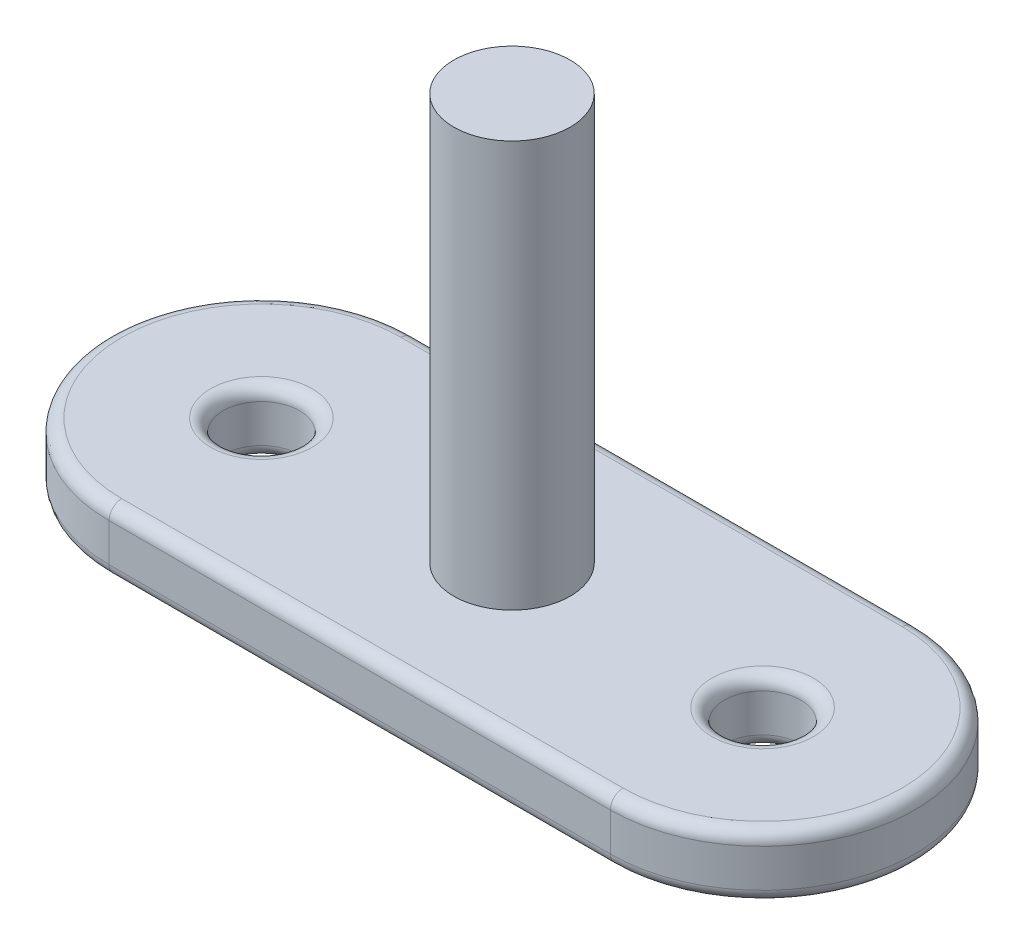
ISO-10303-21;
HEADER;
FILE_DESCRIPTION(('STEP AP214'),'2;1');
FILE_NAME('part.step','',(''),(''),'','','');
FILE_SCHEMA(('AUTOMOTIVE_DESIGN { 1 0 10303 214 1 1 1 1 }'));
ENDSEC;
DATA;
#1=APPLICATION_CONTEXT('core data for automotive mechanical design processes');
#2=APPLICATION_PROTOCOL_DEFINITION('international standard','automotive_design',2000,#1);
#3=PRODUCT_CONTEXT('',#1,'mechanical');
#4=PRODUCT('Part','Part','',(#3));
#5=PRODUCT_RELATED_PRODUCT_CATEGORY('part','',(#4));
#6=PRODUCT_DEFINITION_FORMATION('','',#4);
#7=PRODUCT_DEFINITION_CONTEXT('part definition',#1,'design');
#8=PRODUCT_DEFINITION('design','',#6,#7);
#9=PRODUCT_DEFINITION_SHAPE('','',#8);
#10=(LENGTH_UNIT() NAMED_UNIT(*) SI_UNIT(.MILLI.,.METRE.));
#11=(NAMED_UNIT(*) PLANE_ANGLE_UNIT() SI_UNIT($,.RADIAN.));
#12=(NAMED_UNIT(*) SI_UNIT($,.STERADIAN.) SOLID_ANGLE_UNIT());
#13=UNCERTAINTY_MEASURE_WITH_UNIT(LENGTH_MEASURE(1.E-05),#10,'distance_accuracy_value','');
#14=(GEOMETRIC_REPRESENTATION_CONTEXT(3) GLOBAL_UNCERTAINTY_ASSIGNED_CONTEXT((#13)) GLOBAL_UNIT_ASSIGNED_CONTEXT((#10,
#11,#12)) REPRESENTATION_CONTEXT('',''));
#15=CARTESIAN_POINT('',(0.,0.,0.));
#16=DIRECTION('',(0.,0.,1.));
#17=DIRECTION('',(1.,0.,0.));
#18=AXIS2_PLACEMENT_3D('',#15,#16,#17);
#19=CARTESIAN_POINT('',(-9.87,2.5,0.));
#20=DIRECTION('',(0.,1.,0.));
#21=DIRECTION('',(0.,0.,1.));
#22=AXIS2_PLACEMENT_3D('',#19,#20,#21);
#23=PLANE('',#22);
#24=CARTESIAN_POINT('',(0.,2.5,0.));
#25=DIRECTION('',(0.,1.,0.));
#26=DIRECTION('',(0.,0.,1.));
#27=AXIS2_PLACEMENT_3D('',#24,#25,#26);
#28=CIRCLE('',#27,2.29148448019586);
#29=CARTESIAN_POINT('',(0.,2.5,2.29148448019586));
#30=VERTEX_POINT('',#29);
#31=EDGE_CURVE('E394',#30,#30,#28,.T.);
#32=ORIENTED_EDGE('',*,*,#31,.F.);
#33=EDGE_LOOP('',(#32));
#34=FACE_BOUND('',#33,.T.);
#35=CARTESIAN_POINT('',(9.87,2.5,0.));
#36=DIRECTION('',(0.,1.,0.));
#37=DIRECTION('',(0.,0.,1.));
#38=AXIS2_PLACEMENT_3D('',#35,#36,#37);
#39=CIRCLE('',#38,2.);
#40=CARTESIAN_POINT('',(9.87,2.5,2.));
#41=VERTEX_POINT('',#40);
#42=EDGE_CURVE('E136',#41,#41,#39,.F.);
#43=ORIENTED_EDGE('',*,*,#42,.T.);
#44=EDGE_LOOP('',(#43));
#45=FACE_BOUND('',#44,.T.);
#46=CARTESIAN_POINT('',(9.87,2.5,0.));
#47=DIRECTION('',(0.,1.,0.));
#48=DIRECTION('',(0.,0.,1.));
#49=AXIS2_PLACEMENT_3D('',#46,#47,#48);
#50=CIRCLE('',#49,5.5);
#51=CARTESIAN_POINT('',(9.87,2.5,5.5));
#52=VERTEX_POINT('',#51);
#53=CARTESIAN_POINT('',(9.87,2.5,-5.5));
#54=VERTEX_POINT('',#53);
#55=EDGE_CURVE('E133',#52,#54,#50,.T.);
#56=ORIENTED_EDGE('',*,*,#55,.T.);
#57=DIRECTION('',(-1.,0.,0.));
#58=VECTOR('',#57,1.);
#59=CARTESIAN_POINT('',(-9.87,2.5,-5.5));
#60=LINE('',#59,#58);
#61=CARTESIAN_POINT('',(-9.87,2.5,-5.5));
#62=VERTEX_POINT('',#61);
#63=EDGE_CURVE('E112',#54,#62,#60,.T.);
#64=ORIENTED_EDGE('',*,*,#63,.T.);
#65=CARTESIAN_POINT('',(-9.87,2.5,0.));
#66=DIRECTION('',(0.,1.,0.));
#67=DIRECTION('',(0.,0.,1.));
#68=AXIS2_PLACEMENT_3D('',#65,#66,#67);
#69=CIRCLE('',#68,5.5);
#70=CARTESIAN_POINT('',(-9.87,2.5,5.5));
#71=VERTEX_POINT('',#70);
#72=EDGE_CURVE('E121',#62,#71,#69,.T.);
#73=ORIENTED_EDGE('',*,*,#72,.T.);
#74=DIRECTION('',(1.,0.,0.));
#75=VECTOR('',#74,1.);
#76=CARTESIAN_POINT('',(9.87,2.5,5.5));
#77=LINE('',#76,#75);
#78=EDGE_CURVE('E128',#71,#52,#77,.T.);
#79=ORIENTED_EDGE('',*,*,#78,.T.);
#80=EDGE_LOOP('',(#56,#64,#73,#79));
#81=FACE_BOUND('',#80,.T.);
#82=CARTESIAN_POINT('',(-9.87,2.5,0.));
#83=DIRECTION('',(0.,1.,0.));
#84=DIRECTION('',(0.,0.,1.));
#85=AXIS2_PLACEMENT_3D('',#82,#83,#84);
#86=CIRCLE('',#85,2.);
#87=CARTESIAN_POINT('',(-9.87,2.5,2.));
#88=VERTEX_POINT('',#87);
#89=EDGE_CURVE('E129',#88,#88,#86,.F.);
#90=ORIENTED_EDGE('',*,*,#89,.T.);
#91=EDGE_LOOP('',(#90));
#92=FACE_BOUND('',#91,.T.);
#93=ADVANCED_FACE('F39',(#34,#45,#81,#92),#23,.T.);
#94=CARTESIAN_POINT('',(-9.87,0.,0.));
#95=DIRECTION('',(0.,1.,0.));
#96=DIRECTION('',(0.,0.,1.));
#97=AXIS2_PLACEMENT_3D('',#94,#95,#96);
#98=PLANE('',#97);
#99=CARTESIAN_POINT('',(9.87,0.,0.));
#100=DIRECTION('',(0.,1.,0.));
#101=DIRECTION('',(0.,0.,1.));
#102=AXIS2_PLACEMENT_3D('',#99,#100,#101);
#103=CIRCLE('',#102,2.);
#104=CARTESIAN_POINT('',(9.87,0.,2.));
#105=VERTEX_POINT('',#104);
#106=EDGE_CURVE('E11',#105,#105,#103,.T.);
#107=ORIENTED_EDGE('',*,*,#106,.T.);
#108=EDGE_LOOP('',(#107));
#109=FACE_BOUND('',#108,.T.);
#110=CARTESIAN_POINT('',(-9.87,0.,0.));
#111=DIRECTION('',(0.,1.,0.));
#112=DIRECTION('',(0.,0.,1.));
#113=AXIS2_PLACEMENT_3D('',#110,#111,#112);
#114=CIRCLE('',#113,2.);
#115=CARTESIAN_POINT('',(-9.87,0.,2.));
#116=VERTEX_POINT('',#115);
#117=EDGE_CURVE('E49',#116,#116,#114,.T.);
#118=ORIENTED_EDGE('',*,*,#117,.T.);
#119=EDGE_LOOP('',(#118));
#120=FACE_BOUND('',#119,.T.);
#121=CARTESIAN_POINT('',(9.87,0.,0.));
#122=DIRECTION('',(0.,1.,0.));
#123=DIRECTION('',(0.,0.,1.));
#124=AXIS2_PLACEMENT_3D('',#121,#122,#123);
#125=CIRCLE('',#124,5.5);
#126=CARTESIAN_POINT('',(9.87,0.,-5.5));
#127=VERTEX_POINT('',#126);
#128=CARTESIAN_POINT('',(9.87,0.,5.5));
#129=VERTEX_POINT('',#128);
#130=EDGE_CURVE('E57',#127,#129,#125,.F.);
#131=ORIENTED_EDGE('',*,*,#130,.T.);
#132=DIRECTION('',(1.,0.,0.));
#133=VECTOR('',#132,1.);
#134=CARTESIAN_POINT('',(-9.87,0.,5.5));
#135=LINE('',#134,#133);
#136=CARTESIAN_POINT('',(-9.87,0.,5.5));
#137=VERTEX_POINT('',#136);
#138=EDGE_CURVE('E184',#129,#137,#135,.F.);
#139=ORIENTED_EDGE('',*,*,#138,.T.);
#140=CARTESIAN_POINT('',(-9.87,0.,0.));
#141=DIRECTION('',(0.,1.,0.));
#142=DIRECTION('',(0.,0.,1.));
#143=AXIS2_PLACEMENT_3D('',#140,#141,#142);
#144=CIRCLE('',#143,5.5);
#145=CARTESIAN_POINT('',(-9.87,0.,-5.5));
#146=VERTEX_POINT('',#145);
#147=EDGE_CURVE('E177',#137,#146,#144,.F.);
#148=ORIENTED_EDGE('',*,*,#147,.T.);
#149=DIRECTION('',(-1.,0.,0.));
#150=VECTOR('',#149,1.);
#151=CARTESIAN_POINT('',(-9.87,0.,-5.5));
#152=LINE('',#151,#150);
#153=EDGE_CURVE('E62',#146,#127,#152,.F.);
#154=ORIENTED_EDGE('',*,*,#153,.T.);
#155=EDGE_LOOP('',(#131,#139,#148,#154));
#156=FACE_BOUND('',#155,.T.);
#157=ADVANCED_FACE('F225',(#109,#120,#156),#98,.F.);
#158=CARTESIAN_POINT('',(-9.87,2.5,0.));
#159=DIRECTION('',(0.,-1.,0.));
#160=DIRECTION('',(0.,0.,-1.));
#161=AXIS2_PLACEMENT_3D('',#158,#159,#160);
#162=CYLINDRICAL_SURFACE('',#161,6.);
#163=DIRECTION('',(0.,-1.,0.));
#164=VECTOR('',#163,1.);
#165=CARTESIAN_POINT('',(-9.87,2.5,6.));
#166=LINE('',#165,#164);
#167=CARTESIAN_POINT('',(-9.87,2.,6.));
#168=VERTEX_POINT('',#167);
#169=CARTESIAN_POINT('',(-9.87,0.5,6.));
#170=VERTEX_POINT('',#169);
#171=EDGE_CURVE('E411',#168,#170,#166,.T.);
#172=ORIENTED_EDGE('',*,*,#171,.F.);
#173=CARTESIAN_POINT('',(-9.87,2.,0.));
#174=DIRECTION('',(0.,1.,0.));
#175=DIRECTION('',(0.,0.,1.));
#176=AXIS2_PLACEMENT_3D('',#173,#174,#175);
#177=CIRCLE('',#176,6.);
#178=CARTESIAN_POINT('',(-9.87,2.,-6.));
#179=VERTEX_POINT('',#178);
#180=EDGE_CURVE('E166',#168,#179,#177,.F.);
#181=ORIENTED_EDGE('',*,*,#180,.T.);
#182=DIRECTION('',(0.,-1.,0.));
#183=VECTOR('',#182,1.);
#184=CARTESIAN_POINT('',(-9.87,2.5,-6.));
#185=LINE('',#184,#183);
#186=CARTESIAN_POINT('',(-9.87,0.5,-6.));
#187=VERTEX_POINT('',#186);
#188=EDGE_CURVE('E198',#179,#187,#185,.T.);
#189=ORIENTED_EDGE('',*,*,#188,.T.);
#190=CARTESIAN_POINT('',(-9.87,0.5,0.));
#191=DIRECTION('',(0.,1.,0.));
#192=DIRECTION('',(0.,0.,1.));
#193=AXIS2_PLACEMENT_3D('',#190,#191,#192);
#194=CIRCLE('',#193,6.);
#195=EDGE_CURVE('E163',#187,#170,#194,.T.);
#196=ORIENTED_EDGE('',*,*,#195,.T.);
#197=EDGE_LOOP('',(#172,#181,#189,#196));
#198=FACE_BOUND('',#197,.T.);
#199=ADVANCED_FACE('F227',(#198),#162,.T.);
#200=CARTESIAN_POINT('',(-9.87,2.5,6.));
#201=DIRECTION('',(0.,0.,-1.));
#202=DIRECTION('',(-1.,0.,0.));
#203=AXIS2_PLACEMENT_3D('',#200,#201,#202);
#204=PLANE('',#203);
#205=DIRECTION('',(0.,-1.,0.));
#206=VECTOR('',#205,1.);
#207=CARTESIAN_POINT('',(9.87,2.5,6.));
#208=LINE('',#207,#206);
#209=CARTESIAN_POINT('',(9.87,2.,6.));
#210=VERTEX_POINT('',#209);
#211=CARTESIAN_POINT('',(9.87,0.5,6.));
#212=VERTEX_POINT('',#211);
#213=EDGE_CURVE('E407',#210,#212,#208,.T.);
#214=ORIENTED_EDGE('',*,*,#213,.F.);
#215=DIRECTION('',(1.,0.,0.));
#216=VECTOR('',#215,1.);
#217=CARTESIAN_POINT('',(-9.87,2.,6.));
#218=LINE('',#217,#216);
#219=EDGE_CURVE('E160',#210,#168,#218,.F.);
#220=ORIENTED_EDGE('',*,*,#219,.T.);
#221=ORIENTED_EDGE('',*,*,#171,.T.);
#222=DIRECTION('',(1.,0.,0.));
#223=VECTOR('',#222,1.);
#224=CARTESIAN_POINT('',(-9.87,0.5,6.));
#225=LINE('',#224,#223);
#226=EDGE_CURVE('E156',#170,#212,#225,.T.);
#227=ORIENTED_EDGE('',*,*,#226,.T.);
#228=EDGE_LOOP('',(#214,#220,#221,#227));
#229=FACE_BOUND('',#228,.T.);
#230=ADVANCED_FACE('F234',(#229),#204,.F.);
#231=CARTESIAN_POINT('',(9.87,2.5,0.));
#232=DIRECTION('',(0.,-1.,0.));
#233=DIRECTION('',(0.,0.,-1.));
#234=AXIS2_PLACEMENT_3D('',#231,#232,#233);
#235=CYLINDRICAL_SURFACE('',#234,6.);
#236=DIRECTION('',(0.,-1.,0.));
#237=VECTOR('',#236,1.);
#238=CARTESIAN_POINT('',(9.87,2.5,-6.));
#239=LINE('',#238,#237);
#240=CARTESIAN_POINT('',(9.87,2.,-6.));
#241=VERTEX_POINT('',#240);
#242=CARTESIAN_POINT('',(9.87,0.5,-6.));
#243=VERTEX_POINT('',#242);
#244=EDGE_CURVE('E403',#241,#243,#239,.T.);
#245=ORIENTED_EDGE('',*,*,#244,.F.);
#246=CARTESIAN_POINT('',(9.87,2.,0.));
#247=DIRECTION('',(0.,1.,0.));
#248=DIRECTION('',(0.,0.,1.));
#249=AXIS2_PLACEMENT_3D('',#246,#247,#248);
#250=CIRCLE('',#249,6.);
#251=EDGE_CURVE('E153',#241,#210,#250,.F.);
#252=ORIENTED_EDGE('',*,*,#251,.T.);
#253=ORIENTED_EDGE('',*,*,#213,.T.);
#254=CARTESIAN_POINT('',(9.87,0.5,0.));
#255=DIRECTION('',(0.,1.,0.));
#256=DIRECTION('',(0.,0.,1.));
#257=AXIS2_PLACEMENT_3D('',#254,#255,#256);
#258=CIRCLE('',#257,6.);
#259=EDGE_CURVE('E150',#212,#243,#258,.T.);
#260=ORIENTED_EDGE('',*,*,#259,.T.);
#261=EDGE_LOOP('',(#245,#252,#253,#260));
#262=FACE_BOUND('',#261,.T.);
#263=ADVANCED_FACE('F246',(#262),#235,.T.);
#264=CARTESIAN_POINT('',(-9.87,2.5,-6.));
#265=DIRECTION('',(0.,0.,1.));
#266=DIRECTION('',(1.,0.,0.));
#267=AXIS2_PLACEMENT_3D('',#264,#265,#266);
#268=PLANE('',#267);
#269=ORIENTED_EDGE('',*,*,#188,.F.);
#270=DIRECTION('',(-1.,0.,0.));
#271=VECTOR('',#270,1.);
#272=CARTESIAN_POINT('',(9.87,2.,-6.));
#273=LINE('',#272,#271);
#274=EDGE_CURVE('E114',#179,#241,#273,.F.);
#275=ORIENTED_EDGE('',*,*,#274,.T.);
#276=ORIENTED_EDGE('',*,*,#244,.T.);
#277=DIRECTION('',(-1.,0.,0.));
#278=VECTOR('',#277,1.);
#279=CARTESIAN_POINT('',(-9.87,0.5,-6.));
#280=LINE('',#279,#278);
#281=EDGE_CURVE('E141',#243,#187,#280,.T.);
#282=ORIENTED_EDGE('',*,*,#281,.T.);
#283=EDGE_LOOP('',(#269,#275,#276,#282));
#284=FACE_BOUND('',#283,.T.);
#285=ADVANCED_FACE('F242',(#284),#268,.F.);
#286=CARTESIAN_POINT('',(-9.87,2.5,0.));
#287=DIRECTION('',(0.,-1.,0.));
#288=DIRECTION('',(0.,0.,-1.));
#289=AXIS2_PLACEMENT_3D('',#286,#287,#288);
#290=CYLINDRICAL_SURFACE('',#289,1.5);
#291=CARTESIAN_POINT('',(-9.87,2.,0.));
#292=DIRECTION('',(0.,1.,0.));
#293=DIRECTION('',(0.,0.,1.));
#294=AXIS2_PLACEMENT_3D('',#291,#292,#293);
#295=CIRCLE('',#294,1.5);
#296=CARTESIAN_POINT('',(-9.87,2.,1.5));
#297=VERTEX_POINT('',#296);
#298=EDGE_CURVE('E173',#297,#297,#295,.T.);
#299=ORIENTED_EDGE('',*,*,#298,.T.);
#300=EDGE_LOOP('',(#299));
#301=FACE_BOUND('',#300,.T.);
#302=CARTESIAN_POINT('',(-9.87,0.5,0.));
#303=DIRECTION('',(0.,1.,0.));
#304=DIRECTION('',(0.,0.,1.));
#305=AXIS2_PLACEMENT_3D('',#302,#303,#304);
#306=CIRCLE('',#305,1.5);
#307=CARTESIAN_POINT('',(-9.87,0.5,1.5));
#308=VERTEX_POINT('',#307);
#309=EDGE_CURVE('E169',#308,#308,#306,.F.);
#310=ORIENTED_EDGE('',*,*,#309,.T.);
#311=EDGE_LOOP('',(#310));
#312=FACE_BOUND('',#311,.T.);
#313=ADVANCED_FACE('F245',(#301,#312),#290,.F.);
#314=CARTESIAN_POINT('',(9.87,2.5,0.));
#315=DIRECTION('',(0.,-1.,0.));
#316=DIRECTION('',(0.,0.,-1.));
#317=AXIS2_PLACEMENT_3D('',#314,#315,#316);
#318=CYLINDRICAL_SURFACE('',#317,1.5);
#319=CARTESIAN_POINT('',(9.87,2.,0.));
#320=DIRECTION('',(0.,1.,0.));
#321=DIRECTION('',(0.,0.,1.));
#322=AXIS2_PLACEMENT_3D('',#319,#320,#321);
#323=CIRCLE('',#322,1.5);
#324=CARTESIAN_POINT('',(9.87,2.,1.5));
#325=VERTEX_POINT('',#324);
#326=EDGE_CURVE('E419',#325,#325,#323,.T.);
#327=ORIENTED_EDGE('',*,*,#326,.T.);
#328=EDGE_LOOP('',(#327));
#329=FACE_BOUND('',#328,.T.);
#330=CARTESIAN_POINT('',(9.87,0.5,0.));
#331=DIRECTION('',(0.,1.,0.));
#332=DIRECTION('',(0.,0.,1.));
#333=AXIS2_PLACEMENT_3D('',#330,#331,#332);
#334=CIRCLE('',#333,1.5);
#335=CARTESIAN_POINT('',(9.87,0.5,1.5));
#336=VERTEX_POINT('',#335);
#337=EDGE_CURVE('E415',#336,#336,#334,.F.);
#338=ORIENTED_EDGE('',*,*,#337,.T.);
#339=EDGE_LOOP('',(#338));
#340=FACE_BOUND('',#339,.T.);
#341=ADVANCED_FACE('F258',(#329,#340),#318,.F.);
#342=CARTESIAN_POINT('',(9.87,2.,0.));
#343=DIRECTION('',(0.,1.,0.));
#344=DIRECTION('',(0.,0.,1.));
#345=AXIS2_PLACEMENT_3D('',#342,#343,#344);
#346=TOROIDAL_SURFACE('',#345,2.,0.5);
#347=ORIENTED_EDGE('',*,*,#42,.F.);
#348=EDGE_LOOP('',(#347));
#349=FACE_BOUND('',#348,.T.);
#350=ORIENTED_EDGE('',*,*,#326,.F.);
#351=EDGE_LOOP('',(#350));
#352=FACE_BOUND('',#351,.T.);
#353=ADVANCED_FACE('F254',(#349,#352),#346,.T.);
#354=CARTESIAN_POINT('',(-9.87,2.,5.5));
#355=DIRECTION('',(-1.,0.,0.));
#356=DIRECTION('',(0.,0.,1.));
#357=AXIS2_PLACEMENT_3D('',#354,#355,#356);
#358=CYLINDRICAL_SURFACE('',#357,0.5);
#359=CARTESIAN_POINT('',(-9.87,2.,5.5));
#360=DIRECTION('',(-1.,0.,0.));
#361=DIRECTION('',(0.,0.,1.));
#362=AXIS2_PLACEMENT_3D('',#359,#360,#361);
#363=CIRCLE('',#362,0.5);
#364=EDGE_CURVE('E124',#168,#71,#363,.T.);
#365=ORIENTED_EDGE('',*,*,#364,.F.);
#366=ORIENTED_EDGE('',*,*,#219,.F.);
#367=CARTESIAN_POINT('',(9.87,2.,5.5));
#368=DIRECTION('',(1.,0.,0.));
#369=DIRECTION('',(0.,0.,-1.));
#370=AXIS2_PLACEMENT_3D('',#367,#368,#369);
#371=CIRCLE('',#370,0.5);
#372=EDGE_CURVE('E194',#52,#210,#371,.T.);
#373=ORIENTED_EDGE('',*,*,#372,.F.);
#374=ORIENTED_EDGE('',*,*,#78,.F.);
#375=EDGE_LOOP('',(#365,#366,#373,#374));
#376=FACE_BOUND('',#375,.T.);
#377=ADVANCED_FACE('F257',(#376),#358,.T.);
#378=CARTESIAN_POINT('',(9.87,2.,0.));
#379=DIRECTION('',(0.,1.,0.));
#380=DIRECTION('',(0.,0.,1.));
#381=AXIS2_PLACEMENT_3D('',#378,#379,#380);
#382=TOROIDAL_SURFACE('',#381,5.5,0.5);
#383=ORIENTED_EDGE('',*,*,#372,.T.);
#384=ORIENTED_EDGE('',*,*,#251,.F.);
#385=CARTESIAN_POINT('',(9.87,2.,-5.5));
#386=DIRECTION('',(-1.,0.,0.));
#387=DIRECTION('',(0.,0.,1.));
#388=AXIS2_PLACEMENT_3D('',#385,#386,#387);
#389=CIRCLE('',#388,0.5);
#390=EDGE_CURVE('E118',#54,#241,#389,.T.);
#391=ORIENTED_EDGE('',*,*,#390,.F.);
#392=ORIENTED_EDGE('',*,*,#55,.F.);
#393=EDGE_LOOP('',(#383,#384,#391,#392));
#394=FACE_BOUND('',#393,.T.);
#395=ADVANCED_FACE('F265',(#394),#382,.T.);
#396=CARTESIAN_POINT('',(-9.87,2.,0.));
#397=DIRECTION('',(0.,1.,0.));
#398=DIRECTION('',(0.,0.,1.));
#399=AXIS2_PLACEMENT_3D('',#396,#397,#398);
#400=TOROIDAL_SURFACE('',#399,5.5,0.5);
#401=ORIENTED_EDGE('',*,*,#364,.T.);
#402=ORIENTED_EDGE('',*,*,#72,.F.);
#403=CARTESIAN_POINT('',(-9.87,2.,-5.5));
#404=DIRECTION('',(1.,0.,0.));
#405=DIRECTION('',(0.,0.,-1.));
#406=AXIS2_PLACEMENT_3D('',#403,#404,#405);
#407=CIRCLE('',#406,0.5);
#408=EDGE_CURVE('E108',#179,#62,#407,.T.);
#409=ORIENTED_EDGE('',*,*,#408,.F.);
#410=ORIENTED_EDGE('',*,*,#180,.F.);
#411=EDGE_LOOP('',(#401,#402,#409,#410));
#412=FACE_BOUND('',#411,.T.);
#413=ADVANCED_FACE('F122',(#412),#400,.T.);
#414=CARTESIAN_POINT('',(-9.87,2.,-5.5));
#415=DIRECTION('',(1.,0.,0.));
#416=DIRECTION('',(0.,0.,-1.));
#417=AXIS2_PLACEMENT_3D('',#414,#415,#416);
#418=CYLINDRICAL_SURFACE('',#417,0.5);
#419=ORIENTED_EDGE('',*,*,#390,.T.);
#420=ORIENTED_EDGE('',*,*,#274,.F.);
#421=ORIENTED_EDGE('',*,*,#408,.T.);
#422=ORIENTED_EDGE('',*,*,#63,.F.);
#423=EDGE_LOOP('',(#419,#420,#421,#422));
#424=FACE_BOUND('',#423,.T.);
#425=ADVANCED_FACE('F110',(#424),#418,.T.);
#426=CARTESIAN_POINT('',(-9.87,2.,0.));
#427=DIRECTION('',(0.,1.,0.));
#428=DIRECTION('',(0.,0.,1.));
#429=AXIS2_PLACEMENT_3D('',#426,#427,#428);
#430=TOROIDAL_SURFACE('',#429,2.,0.5);
#431=ORIENTED_EDGE('',*,*,#89,.F.);
#432=EDGE_LOOP('',(#431));
#433=FACE_BOUND('',#432,.T.);
#434=ORIENTED_EDGE('',*,*,#298,.F.);
#435=EDGE_LOOP('',(#434));
#436=FACE_BOUND('',#435,.T.);
#437=ADVANCED_FACE('F262',(#433,#436),#430,.T.);
#438=CARTESIAN_POINT('',(9.87,0.5,0.));
#439=DIRECTION('',(0.,1.,0.));
#440=DIRECTION('',(0.,0.,1.));
#441=AXIS2_PLACEMENT_3D('',#438,#439,#440);
#442=TOROIDAL_SURFACE('',#441,2.,0.5);
#443=ORIENTED_EDGE('',*,*,#337,.F.);
#444=EDGE_LOOP('',(#443));
#445=FACE_BOUND('',#444,.T.);
#446=ORIENTED_EDGE('',*,*,#106,.F.);
#447=EDGE_LOOP('',(#446));
#448=FACE_BOUND('',#447,.T.);
#449=ADVANCED_FACE('F274',(#445,#448),#442,.T.);
#450=CARTESIAN_POINT('',(-9.87,0.5,0.));
#451=DIRECTION('',(0.,1.,0.));
#452=DIRECTION('',(0.,0.,1.));
#453=AXIS2_PLACEMENT_3D('',#450,#451,#452);
#454=TOROIDAL_SURFACE('',#453,2.,0.5);
#455=ORIENTED_EDGE('',*,*,#309,.F.);
#456=EDGE_LOOP('',(#455));
#457=FACE_BOUND('',#456,.T.);
#458=ORIENTED_EDGE('',*,*,#117,.F.);
#459=EDGE_LOOP('',(#458));
#460=FACE_BOUND('',#459,.T.);
#461=ADVANCED_FACE('F278',(#457,#460),#454,.T.);
#462=CARTESIAN_POINT('',(-9.87,0.5,-5.5));
#463=DIRECTION('',(-1.,0.,0.));
#464=DIRECTION('',(0.,0.,1.));
#465=AXIS2_PLACEMENT_3D('',#462,#463,#464);
#466=CYLINDRICAL_SURFACE('',#465,0.5);
#467=CARTESIAN_POINT('',(9.87,0.5,-5.5));
#468=DIRECTION('',(1.,0.,0.));
#469=DIRECTION('',(0.,0.,-1.));
#470=AXIS2_PLACEMENT_3D('',#467,#468,#469);
#471=CIRCLE('',#470,0.5);
#472=EDGE_CURVE('E205',#127,#243,#471,.T.);
#473=ORIENTED_EDGE('',*,*,#472,.F.);
#474=ORIENTED_EDGE('',*,*,#153,.F.);
#475=CARTESIAN_POINT('',(-9.87,0.5,-5.5));
#476=DIRECTION('',(-1.,0.,0.));
#477=DIRECTION('',(0.,0.,1.));
#478=AXIS2_PLACEMENT_3D('',#475,#476,#477);
#479=CIRCLE('',#478,0.5);
#480=EDGE_CURVE('E43',#187,#146,#479,.T.);
#481=ORIENTED_EDGE('',*,*,#480,.F.);
#482=ORIENTED_EDGE('',*,*,#281,.F.);
#483=EDGE_LOOP('',(#473,#474,#481,#482));
#484=FACE_BOUND('',#483,.T.);
#485=ADVANCED_FACE('F41',(#484),#466,.T.);
#486=CARTESIAN_POINT('',(-9.87,0.5,0.));
#487=DIRECTION('',(0.,1.,0.));
#488=DIRECTION('',(0.,0.,1.));
#489=AXIS2_PLACEMENT_3D('',#486,#487,#488);
#490=TOROIDAL_SURFACE('',#489,5.5,0.5);
#491=ORIENTED_EDGE('',*,*,#480,.T.);
#492=ORIENTED_EDGE('',*,*,#147,.F.);
#493=CARTESIAN_POINT('',(-9.87,0.5,5.5));
#494=DIRECTION('',(1.,0.,0.));
#495=DIRECTION('',(0.,0.,-1.));
#496=AXIS2_PLACEMENT_3D('',#493,#494,#495);
#497=CIRCLE('',#496,0.5);
#498=EDGE_CURVE('E202',#170,#137,#497,.T.);
#499=ORIENTED_EDGE('',*,*,#498,.F.);
#500=ORIENTED_EDGE('',*,*,#195,.F.);
#501=EDGE_LOOP('',(#491,#492,#499,#500));
#502=FACE_BOUND('',#501,.T.);
#503=ADVANCED_FACE('F216',(#502),#490,.T.);
#504=CARTESIAN_POINT('',(9.87,0.5,0.));
#505=DIRECTION('',(0.,1.,0.));
#506=DIRECTION('',(0.,0.,1.));
#507=AXIS2_PLACEMENT_3D('',#504,#505,#506);
#508=TOROIDAL_SURFACE('',#507,5.5,0.5);
#509=ORIENTED_EDGE('',*,*,#472,.T.);
#510=ORIENTED_EDGE('',*,*,#259,.F.);
#511=CARTESIAN_POINT('',(9.87,0.5,5.5));
#512=DIRECTION('',(-1.,0.,0.));
#513=DIRECTION('',(0.,0.,1.));
#514=AXIS2_PLACEMENT_3D('',#511,#512,#513);
#515=CIRCLE('',#514,0.5);
#516=EDGE_CURVE('E199',#129,#212,#515,.T.);
#517=ORIENTED_EDGE('',*,*,#516,.F.);
#518=ORIENTED_EDGE('',*,*,#130,.F.);
#519=EDGE_LOOP('',(#509,#510,#517,#518));
#520=FACE_BOUND('',#519,.T.);
#521=ADVANCED_FACE('F221',(#520),#508,.T.);
#522=CARTESIAN_POINT('',(-9.87,0.5,5.5));
#523=DIRECTION('',(1.,0.,0.));
#524=DIRECTION('',(0.,0.,-1.));
#525=AXIS2_PLACEMENT_3D('',#522,#523,#524);
#526=CYLINDRICAL_SURFACE('',#525,0.5);
#527=ORIENTED_EDGE('',*,*,#498,.T.);
#528=ORIENTED_EDGE('',*,*,#138,.F.);
#529=ORIENTED_EDGE('',*,*,#516,.T.);
#530=ORIENTED_EDGE('',*,*,#226,.F.);
#531=EDGE_LOOP('',(#527,#528,#529,#530));
#532=FACE_BOUND('',#531,.T.);
#533=ADVANCED_FACE('F224',(#532),#526,.T.);
#534=CARTESIAN_POINT('',(0.,18.5,0.));
#535=DIRECTION('',(0.,-1.,0.));
#536=DIRECTION('',(0.,0.,-1.));
#537=AXIS2_PLACEMENT_3D('',#534,#535,#536);
#538=CYLINDRICAL_SURFACE('',#537,2.29148448019586);
#539=CARTESIAN_POINT('',(0.,18.5,0.));
#540=DIRECTION('',(0.,1.,0.));
#541=DIRECTION('',(0.,0.,1.));
#542=AXIS2_PLACEMENT_3D('',#539,#540,#541);
#543=CIRCLE('',#542,2.29148448019586);
#544=CARTESIAN_POINT('',(0.,18.5,2.29148448019586));
#545=VERTEX_POINT('',#544);
#546=EDGE_CURVE('E203',#545,#545,#543,.T.);
#547=ORIENTED_EDGE('',*,*,#546,.F.);
#548=EDGE_LOOP('',(#547));
#549=FACE_BOUND('',#548,.T.);
#550=ORIENTED_EDGE('',*,*,#31,.T.);
#551=EDGE_LOOP('',(#550));
#552=FACE_BOUND('',#551,.T.);
#553=ADVANCED_FACE('F285',(#549,#552),#538,.T.);
#554=CARTESIAN_POINT('',(0.,18.5,0.));
#555=DIRECTION('',(0.,1.,0.));
#556=DIRECTION('',(0.,0.,1.));
#557=AXIS2_PLACEMENT_3D('',#554,#555,#556);
#558=PLANE('',#557);
#559=ORIENTED_EDGE('',*,*,#546,.T.);
#560=EDGE_LOOP('',(#559));
#561=FACE_BOUND('',#560,.T.);
#562=ADVANCED_FACE('F377',(#561),#558,.T.);
#563=CLOSED_SHELL('',(#93,#157,#199,#230,#263,#285,#313,#341,#353,#377,#395,#413,#425,#437,#449,
#461,#485,#503,#521,#533,#553,#562));
#564=MANIFOLD_SOLID_BREP('B2',#563);
#565=ADVANCED_BREP_SHAPE_REPRESENTATION('',(#18,#564),#14);
#566=SHAPE_DEFINITION_REPRESENTATION(#9,#565);
ENDSEC;
END-ISO-10303-21;
